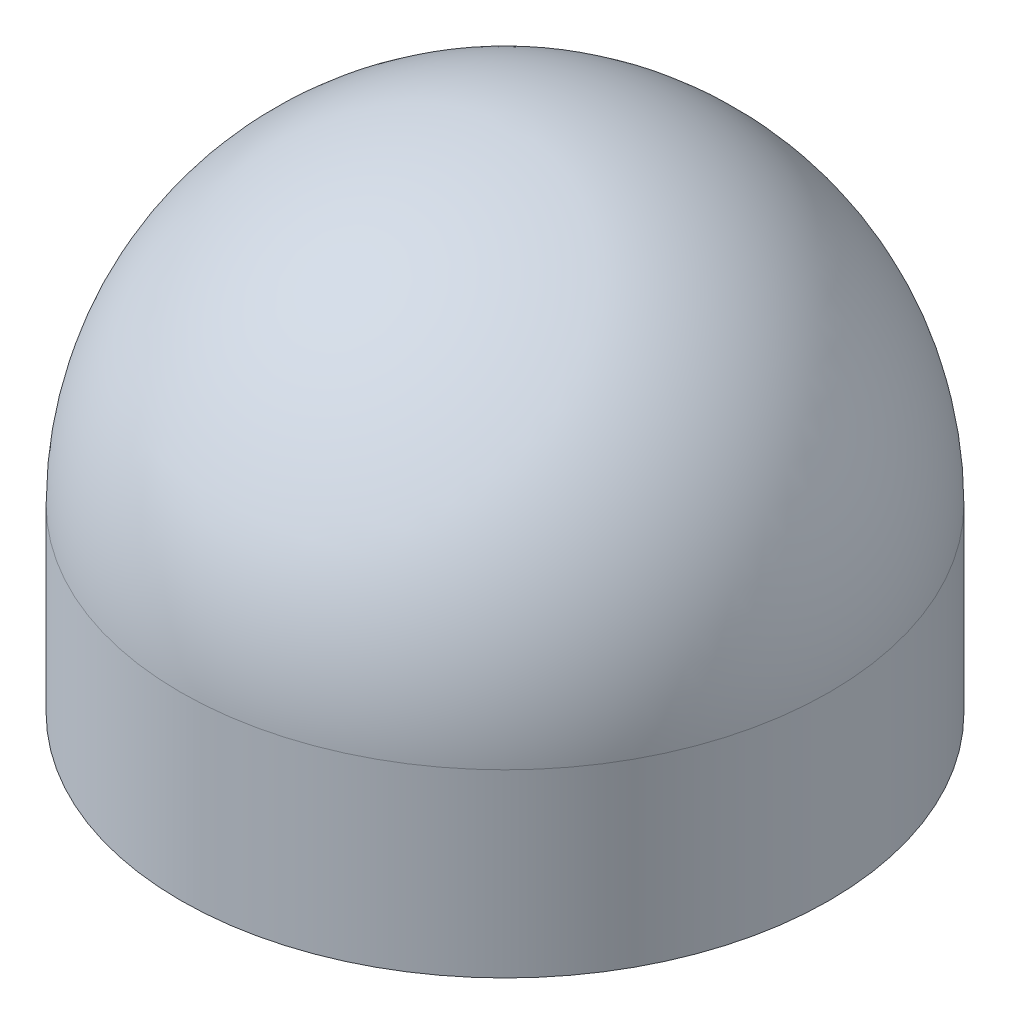
ISO-10303-21;
HEADER;
FILE_DESCRIPTION(('STEP AP214'),'2;1');
FILE_NAME('part.step','',(''),(''),'','','');
FILE_SCHEMA(('AUTOMOTIVE_DESIGN { 1 0 10303 214 1 1 1 1 }'));
ENDSEC;
DATA;
#1=APPLICATION_CONTEXT('core data for automotive mechanical design processes');
#2=APPLICATION_PROTOCOL_DEFINITION('international standard','automotive_design',2000,#1);
#3=PRODUCT_CONTEXT('',#1,'mechanical');
#4=PRODUCT('Part','Part','',(#3));
#5=PRODUCT_RELATED_PRODUCT_CATEGORY('part','',(#4));
#6=PRODUCT_DEFINITION_FORMATION('','',#4);
#7=PRODUCT_DEFINITION_CONTEXT('part definition',#1,'design');
#8=PRODUCT_DEFINITION('design','',#6,#7);
#9=PRODUCT_DEFINITION_SHAPE('','',#8);
#10=(LENGTH_UNIT() NAMED_UNIT(*) SI_UNIT(.MILLI.,.METRE.));
#11=(NAMED_UNIT(*) PLANE_ANGLE_UNIT() SI_UNIT($,.RADIAN.));
#12=(NAMED_UNIT(*) SI_UNIT($,.STERADIAN.) SOLID_ANGLE_UNIT());
#13=UNCERTAINTY_MEASURE_WITH_UNIT(LENGTH_MEASURE(1.E-05),#10,'distance_accuracy_value','');
#14=(GEOMETRIC_REPRESENTATION_CONTEXT(3) GLOBAL_UNCERTAINTY_ASSIGNED_CONTEXT((#13)) GLOBAL_UNIT_ASSIGNED_CONTEXT((#10,
#11,#12)) REPRESENTATION_CONTEXT('',''));
#15=CARTESIAN_POINT('',(0.,0.,0.));
#16=DIRECTION('',(0.,0.,1.));
#17=DIRECTION('',(1.,0.,0.));
#18=AXIS2_PLACEMENT_3D('',#15,#16,#17);
#19=CARTESIAN_POINT('',(0.,0.,0.));
#20=DIRECTION('',(0.,0.,-1.));
#21=DIRECTION('',(-1.,0.,0.));
#22=AXIS2_PLACEMENT_3D('',#19,#20,#21);
#23=SPHERICAL_SURFACE('',#22,9.);
#24=CARTESIAN_POINT('',(0.,0.,0.));
#25=DIRECTION('',(0.,-1.,0.));
#26=DIRECTION('',(0.,0.,1.));
#27=AXIS2_PLACEMENT_3D('',#24,#25,#26);
#28=SPHERICAL_SURFACE('',#27,9.);
#29=CARTESIAN_POINT('',(0.,0.,0.));
#30=DIRECTION('',(0.,-1.,0.));
#31=DIRECTION('',(0.,0.,1.));
#32=AXIS2_PLACEMENT_3D('',#29,#30,#31);
#33=CIRCLE('',#32,9.);
#34=CARTESIAN_POINT('',(0.,0.,9.));
#35=VERTEX_POINT('',#34);
#36=EDGE_CURVE('E10',#35,#35,#33,.T.);
#37=ORIENTED_EDGE('',*,*,#36,.F.);
#38=EDGE_LOOP('',(#37));
#39=FACE_BOUND('',#38,.T.);
#40=ADVANCED_FACE('F43',(#39),#28,.T.);
#41=CARTESIAN_POINT('',(0.,-5.,0.));
#42=DIRECTION('',(0.,1.,0.));
#43=DIRECTION('',(0.,0.,1.));
#44=AXIS2_PLACEMENT_3D('',#41,#42,#43);
#45=PLANE('',#44);
#46=CARTESIAN_POINT('',(0.,-5.,0.));
#47=DIRECTION('',(0.,1.,0.));
#48=DIRECTION('',(0.,0.,1.));
#49=AXIS2_PLACEMENT_3D('',#46,#47,#48);
#50=CIRCLE('',#49,8.);
#51=CARTESIAN_POINT('',(0.,-5.,8.));
#52=VERTEX_POINT('',#51);
#53=EDGE_CURVE('E55',#52,#52,#50,.T.);
#54=ORIENTED_EDGE('',*,*,#53,.T.);
#55=EDGE_LOOP('',(#54));
#56=FACE_BOUND('',#55,.T.);
#57=CARTESIAN_POINT('',(0.,-5.,0.));
#58=DIRECTION('',(0.,1.,0.));
#59=DIRECTION('',(0.,0.,1.));
#60=AXIS2_PLACEMENT_3D('',#57,#58,#59);
#61=CIRCLE('',#60,9.);
#62=CARTESIAN_POINT('',(0.,-5.,9.));
#63=VERTEX_POINT('',#62);
#64=EDGE_CURVE('E50',#63,#63,#61,.T.);
#65=ORIENTED_EDGE('',*,*,#64,.F.);
#66=EDGE_LOOP('',(#65));
#67=FACE_BOUND('',#66,.T.);
#68=ADVANCED_FACE('F79',(#56,#67),#45,.F.);
#69=CARTESIAN_POINT('',(0.,0.,0.));
#70=DIRECTION('',(0.,1.,0.));
#71=DIRECTION('',(0.,0.,1.));
#72=AXIS2_PLACEMENT_3D('',#69,#70,#71);
#73=CYLINDRICAL_SURFACE('',#72,9.);
#74=ORIENTED_EDGE('',*,*,#36,.T.);
#75=EDGE_LOOP('',(#74));
#76=FACE_BOUND('',#75,.T.);
#77=ORIENTED_EDGE('',*,*,#64,.T.);
#78=EDGE_LOOP('',(#77));
#79=FACE_BOUND('',#78,.T.);
#80=ADVANCED_FACE('F76',(#76,#79),#73,.T.);
#81=CARTESIAN_POINT('',(0.,-0.103681501621369,0.));
#82=DIRECTION('',(0.,1.,0.));
#83=DIRECTION('',(0.,0.,1.));
#84=AXIS2_PLACEMENT_3D('',#81,#82,#83);
#85=CYLINDRICAL_SURFACE('',#84,8.);
#86=CARTESIAN_POINT('',(0.,-0.10368150162137,0.));
#87=DIRECTION('',(0.,1.,0.));
#88=DIRECTION('',(0.,0.,1.));
#89=AXIS2_PLACEMENT_3D('',#86,#87,#88);
#90=CIRCLE('',#89,8.);
#91=CARTESIAN_POINT('',(0.,-0.103681501621371,8.));
#92=VERTEX_POINT('',#91);
#93=EDGE_CURVE('E60',#92,#92,#90,.T.);
#94=ORIENTED_EDGE('',*,*,#93,.T.);
#95=EDGE_LOOP('',(#94));
#96=FACE_BOUND('',#95,.T.);
#97=ORIENTED_EDGE('',*,*,#53,.F.);
#98=EDGE_LOOP('',(#97));
#99=FACE_BOUND('',#98,.T.);
#100=ADVANCED_FACE('F67',(#96,#99),#85,.F.);
#101=CARTESIAN_POINT('',(0.,-0.103681501621369,0.));
#102=DIRECTION('',(0.,-1.,0.));
#103=DIRECTION('',(0.,0.,-1.));
#104=AXIS2_PLACEMENT_3D('',#101,#102,#103);
#105=PLANE('',#104);
#106=ORIENTED_EDGE('',*,*,#93,.F.);
#107=EDGE_LOOP('',(#106));
#108=FACE_BOUND('',#107,.T.);
#109=ADVANCED_FACE('F70',(#108),#105,.T.);
#110=CLOSED_SHELL('',(#40,#68,#80,#100,#109));
#111=MANIFOLD_SOLID_BREP('B2',#110);
#112=ADVANCED_BREP_SHAPE_REPRESENTATION('',(#18,#111),#14);
#113=SHAPE_DEFINITION_REPRESENTATION(#9,#112);
ENDSEC;
END-ISO-10303-21;
